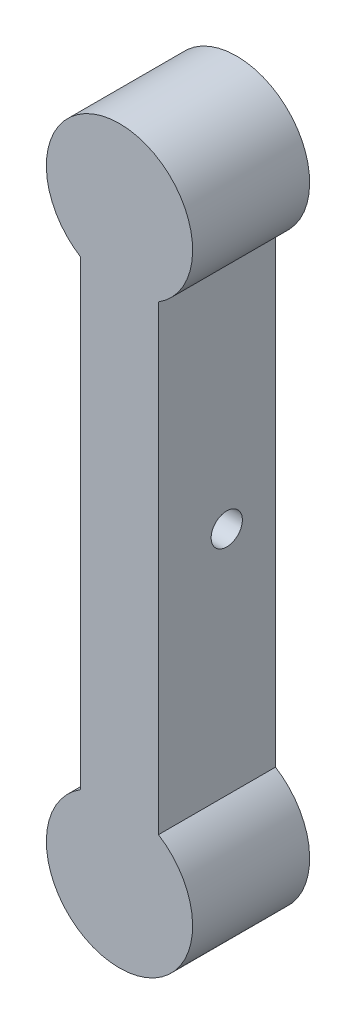
ISO-10303-21;
HEADER;
FILE_DESCRIPTION(('STEP AP214'),'2;1');
FILE_NAME('part.step','',(''),(''),'','','');
FILE_SCHEMA(('AUTOMOTIVE_DESIGN { 1 0 10303 214 1 1 1 1 }'));
ENDSEC;
DATA;
#1=APPLICATION_CONTEXT('core data for automotive mechanical design processes');
#2=APPLICATION_PROTOCOL_DEFINITION('international standard','automotive_design',2000,#1);
#3=PRODUCT_CONTEXT('',#1,'mechanical');
#4=PRODUCT('Part','Part','',(#3));
#5=PRODUCT_RELATED_PRODUCT_CATEGORY('part','',(#4));
#6=PRODUCT_DEFINITION_FORMATION('','',#4);
#7=PRODUCT_DEFINITION_CONTEXT('part definition',#1,'design');
#8=PRODUCT_DEFINITION('design','',#6,#7);
#9=PRODUCT_DEFINITION_SHAPE('','',#8);
#10=(LENGTH_UNIT() NAMED_UNIT(*) SI_UNIT(.MILLI.,.METRE.));
#11=(NAMED_UNIT(*) PLANE_ANGLE_UNIT() SI_UNIT($,.RADIAN.));
#12=(NAMED_UNIT(*) SI_UNIT($,.STERADIAN.) SOLID_ANGLE_UNIT());
#13=UNCERTAINTY_MEASURE_WITH_UNIT(LENGTH_MEASURE(1.E-05),#10,'distance_accuracy_value','');
#14=(GEOMETRIC_REPRESENTATION_CONTEXT(3) GLOBAL_UNCERTAINTY_ASSIGNED_CONTEXT((#13)) GLOBAL_UNIT_ASSIGNED_CONTEXT((#10,
#11,#12)) REPRESENTATION_CONTEXT('',''));
#15=CARTESIAN_POINT('',(0.,0.,0.));
#16=DIRECTION('',(0.,0.,1.));
#17=DIRECTION('',(1.,0.,0.));
#18=AXIS2_PLACEMENT_3D('',#15,#16,#17);
#19=CARTESIAN_POINT('',(0.,60.,0.));
#20=DIRECTION('',(0.,0.,1.));
#21=DIRECTION('',(1.,0.,0.));
#22=AXIS2_PLACEMENT_3D('',#19,#20,#21);
#23=PLANE('',#22);
#24=CARTESIAN_POINT('',(0.,60.,0.));
#25=DIRECTION('',(0.,0.,1.));
#26=DIRECTION('',(1.,0.,0.));
#27=AXIS2_PLACEMENT_3D('',#24,#25,#26);
#28=CIRCLE('',#27,7.5);
#29=CARTESIAN_POINT('',(3.99999999999999,53.6557112297752,0.));
#30=VERTEX_POINT('',#29);
#31=CARTESIAN_POINT('',(-3.99999999999999,53.6557112297752,0.));
#32=VERTEX_POINT('',#31);
#33=EDGE_CURVE('E80',#30,#32,#28,.T.);
#34=ORIENTED_EDGE('',*,*,#33,.F.);
#35=DIRECTION('',(0.,1.,0.));
#36=VECTOR('',#35,1.);
#37=CARTESIAN_POINT('',(3.99999999999999,53.6557112297752,0.));
#38=LINE('',#37,#36);
#39=CARTESIAN_POINT('',(4.00000000000001,6.34428877022476,0.));
#40=VERTEX_POINT('',#39);
#41=EDGE_CURVE('E49',#40,#30,#38,.T.);
#42=ORIENTED_EDGE('',*,*,#41,.F.);
#43=CARTESIAN_POINT('',(0.,0.,0.));
#44=DIRECTION('',(0.,0.,1.));
#45=DIRECTION('',(1.,0.,0.));
#46=AXIS2_PLACEMENT_3D('',#43,#44,#45);
#47=CIRCLE('',#46,7.50000000000001);
#48=CARTESIAN_POINT('',(-4.,6.34428877022476,0.));
#49=VERTEX_POINT('',#48);
#50=EDGE_CURVE('E57',#49,#40,#47,.T.);
#51=ORIENTED_EDGE('',*,*,#50,.F.);
#52=DIRECTION('',(0.,-1.,0.));
#53=VECTOR('',#52,1.);
#54=CARTESIAN_POINT('',(-3.99999999999999,53.6557112297752,0.));
#55=LINE('',#54,#53);
#56=EDGE_CURVE('E114',#32,#49,#55,.T.);
#57=ORIENTED_EDGE('',*,*,#56,.F.);
#58=EDGE_LOOP('',(#34,#42,#51,#57));
#59=FACE_BOUND('',#58,.T.);
#60=CARTESIAN_POINT('',(0.,60.,0.));
#61=DIRECTION('',(0.,0.,1.));
#62=DIRECTION('',(1.,0.,0.));
#63=AXIS2_PLACEMENT_3D('',#60,#61,#62);
#64=CIRCLE('',#63,4.00000000000001);
#65=CARTESIAN_POINT('',(4.00000000000001,60.,0.));
#66=VERTEX_POINT('',#65);
#67=EDGE_CURVE('E110',#66,#66,#64,.T.);
#68=ORIENTED_EDGE('',*,*,#67,.T.);
#69=EDGE_LOOP('',(#68));
#70=FACE_BOUND('',#69,.T.);
#71=CARTESIAN_POINT('',(0.,0.,0.));
#72=DIRECTION('',(0.,0.,1.));
#73=DIRECTION('',(1.,0.,0.));
#74=AXIS2_PLACEMENT_3D('',#71,#72,#73);
#75=CIRCLE('',#74,4.);
#76=CARTESIAN_POINT('',(4.,0.,0.));
#77=VERTEX_POINT('',#76);
#78=EDGE_CURVE('E107',#77,#77,#75,.T.);
#79=ORIENTED_EDGE('',*,*,#78,.T.);
#80=EDGE_LOOP('',(#79));
#81=FACE_BOUND('',#80,.T.);
#82=ADVANCED_FACE('F33',(#59,#70,#81),#23,.F.);
#83=CARTESIAN_POINT('',(0.,60.,10.));
#84=DIRECTION('',(0.,0.,-1.));
#85=DIRECTION('',(-1.,0.,0.));
#86=AXIS2_PLACEMENT_3D('',#83,#84,#85);
#87=CYLINDRICAL_SURFACE('',#86,7.5);
#88=ORIENTED_EDGE('',*,*,#33,.T.);
#89=DIRECTION('',(0.,0.,-1.));
#90=VECTOR('',#89,1.);
#91=CARTESIAN_POINT('',(-3.99999999999999,53.6557112297752,10.));
#92=LINE('',#91,#90);
#93=CARTESIAN_POINT('',(-3.99999999999999,53.6557112297752,12.));
#94=VERTEX_POINT('',#93);
#95=EDGE_CURVE('E11',#94,#32,#92,.T.);
#96=ORIENTED_EDGE('',*,*,#95,.F.);
#97=CARTESIAN_POINT('',(0.,60.,12.));
#98=DIRECTION('',(0.,0.,1.));
#99=DIRECTION('',(1.,0.,0.));
#100=AXIS2_PLACEMENT_3D('',#97,#98,#99);
#101=CIRCLE('',#100,7.5);
#102=CARTESIAN_POINT('',(4.00000000000001,53.6557112297752,12.));
#103=VERTEX_POINT('',#102);
#104=EDGE_CURVE('E78',#103,#94,#101,.T.);
#105=ORIENTED_EDGE('',*,*,#104,.F.);
#106=DIRECTION('',(0.,0.,-1.));
#107=VECTOR('',#106,1.);
#108=CARTESIAN_POINT('',(3.99999999999999,53.6557112297752,10.));
#109=LINE('',#108,#107);
#110=EDGE_CURVE('E118',#103,#30,#109,.T.);
#111=ORIENTED_EDGE('',*,*,#110,.T.);
#112=EDGE_LOOP('',(#88,#96,#105,#111));
#113=FACE_BOUND('',#112,.T.);
#114=ADVANCED_FACE('F35',(#113),#87,.T.);
#115=CARTESIAN_POINT('',(-3.99999999999999,53.6557112297752,10.));
#116=DIRECTION('',(1.,0.,0.));
#117=DIRECTION('',(0.,1.,0.));
#118=AXIS2_PLACEMENT_3D('',#115,#116,#117);
#119=PLANE('',#118);
#120=CARTESIAN_POINT('',(-4.,30.,5.));
#121=DIRECTION('',(-1.,0.,0.));
#122=DIRECTION('',(0.,-1.,0.));
#123=AXIS2_PLACEMENT_3D('',#120,#121,#122);
#124=CIRCLE('',#123,1.6);
#125=CARTESIAN_POINT('',(-4.,28.4,5.));
#126=VERTEX_POINT('',#125);
#127=EDGE_CURVE('E104',#126,#126,#124,.T.);
#128=ORIENTED_EDGE('',*,*,#127,.F.);
#129=EDGE_LOOP('',(#128));
#130=FACE_BOUND('',#129,.T.);
#131=ORIENTED_EDGE('',*,*,#56,.T.);
#132=DIRECTION('',(0.,0.,-1.));
#133=VECTOR('',#132,1.);
#134=CARTESIAN_POINT('',(-4.,6.34428877022476,10.));
#135=LINE('',#134,#133);
#136=CARTESIAN_POINT('',(-3.99999999999999,6.34428877022476,12.));
#137=VERTEX_POINT('',#136);
#138=EDGE_CURVE('E42',#137,#49,#135,.T.);
#139=ORIENTED_EDGE('',*,*,#138,.F.);
#140=DIRECTION('',(0.,-1.,0.));
#141=VECTOR('',#140,1.);
#142=CARTESIAN_POINT('',(-3.99999999999999,53.6557112297752,12.));
#143=LINE('',#142,#141);
#144=EDGE_CURVE('E83',#94,#137,#143,.T.);
#145=ORIENTED_EDGE('',*,*,#144,.F.);
#146=ORIENTED_EDGE('',*,*,#95,.T.);
#147=EDGE_LOOP('',(#131,#139,#145,#146));
#148=FACE_BOUND('',#147,.T.);
#149=ADVANCED_FACE('F84',(#130,#148),#119,.F.);
#150=CARTESIAN_POINT('',(0.,0.,10.));
#151=DIRECTION('',(0.,0.,-1.));
#152=DIRECTION('',(-1.,0.,0.));
#153=AXIS2_PLACEMENT_3D('',#150,#151,#152);
#154=CYLINDRICAL_SURFACE('',#153,7.50000000000001);
#155=ORIENTED_EDGE('',*,*,#50,.T.);
#156=DIRECTION('',(0.,0.,-1.));
#157=VECTOR('',#156,1.);
#158=CARTESIAN_POINT('',(4.00000000000001,6.34428877022476,10.));
#159=LINE('',#158,#157);
#160=CARTESIAN_POINT('',(4.00000000000001,6.34428877022475,12.));
#161=VERTEX_POINT('',#160);
#162=EDGE_CURVE('E120',#161,#40,#159,.T.);
#163=ORIENTED_EDGE('',*,*,#162,.F.);
#164=CARTESIAN_POINT('',(0.,0.,12.));
#165=DIRECTION('',(0.,0.,1.));
#166=DIRECTION('',(1.,0.,0.));
#167=AXIS2_PLACEMENT_3D('',#164,#165,#166);
#168=CIRCLE('',#167,7.5);
#169=EDGE_CURVE('E88',#137,#161,#168,.T.);
#170=ORIENTED_EDGE('',*,*,#169,.F.);
#171=ORIENTED_EDGE('',*,*,#138,.T.);
#172=EDGE_LOOP('',(#155,#163,#170,#171));
#173=FACE_BOUND('',#172,.T.);
#174=ADVANCED_FACE('F122',(#173),#154,.T.);
#175=CARTESIAN_POINT('',(3.99999999999999,53.6557112297752,10.));
#176=DIRECTION('',(-1.,0.,0.));
#177=DIRECTION('',(0.,-1.,0.));
#178=AXIS2_PLACEMENT_3D('',#175,#176,#177);
#179=PLANE('',#178);
#180=CARTESIAN_POINT('',(4.,30.,5.));
#181=DIRECTION('',(-1.,0.,0.));
#182=DIRECTION('',(0.,-1.,0.));
#183=AXIS2_PLACEMENT_3D('',#180,#181,#182);
#184=CIRCLE('',#183,1.6);
#185=CARTESIAN_POINT('',(4.00000000000001,28.4,5.));
#186=VERTEX_POINT('',#185);
#187=EDGE_CURVE('E37',#186,#186,#184,.T.);
#188=ORIENTED_EDGE('',*,*,#187,.T.);
#189=EDGE_LOOP('',(#188));
#190=FACE_BOUND('',#189,.T.);
#191=ORIENTED_EDGE('',*,*,#41,.T.);
#192=ORIENTED_EDGE('',*,*,#110,.F.);
#193=DIRECTION('',(0.,1.,0.));
#194=VECTOR('',#193,1.);
#195=CARTESIAN_POINT('',(4.00000000000001,53.6557112297752,12.));
#196=LINE('',#195,#194);
#197=EDGE_CURVE('E93',#161,#103,#196,.T.);
#198=ORIENTED_EDGE('',*,*,#197,.F.);
#199=ORIENTED_EDGE('',*,*,#162,.T.);
#200=EDGE_LOOP('',(#191,#192,#198,#199));
#201=FACE_BOUND('',#200,.T.);
#202=ADVANCED_FACE('F144',(#190,#201),#179,.F.);
#203=CARTESIAN_POINT('',(0.,60.,10.));
#204=DIRECTION('',(0.,0.,-1.));
#205=DIRECTION('',(-1.,0.,0.));
#206=AXIS2_PLACEMENT_3D('',#203,#204,#205);
#207=CYLINDRICAL_SURFACE('',#206,4.00000000000001);
#208=CARTESIAN_POINT('',(0.,60.,10.));
#209=DIRECTION('',(0.,0.,1.));
#210=DIRECTION('',(1.,0.,0.));
#211=AXIS2_PLACEMENT_3D('',#208,#209,#210);
#212=CIRCLE('',#211,4.00000000000001);
#213=CARTESIAN_POINT('',(4.00000000000001,60.,10.));
#214=VERTEX_POINT('',#213);
#215=EDGE_CURVE('E101',#214,#214,#212,.T.);
#216=ORIENTED_EDGE('',*,*,#215,.T.);
#217=EDGE_LOOP('',(#216));
#218=FACE_BOUND('',#217,.T.);
#219=ORIENTED_EDGE('',*,*,#67,.F.);
#220=EDGE_LOOP('',(#219));
#221=FACE_BOUND('',#220,.T.);
#222=ADVANCED_FACE('F134',(#218,#221),#207,.F.);
#223=CARTESIAN_POINT('',(0.,0.,10.));
#224=DIRECTION('',(0.,0.,-1.));
#225=DIRECTION('',(-1.,0.,0.));
#226=AXIS2_PLACEMENT_3D('',#223,#224,#225);
#227=CYLINDRICAL_SURFACE('',#226,4.);
#228=CARTESIAN_POINT('',(0.,0.,10.));
#229=DIRECTION('',(0.,0.,1.));
#230=DIRECTION('',(1.,0.,0.));
#231=AXIS2_PLACEMENT_3D('',#228,#229,#230);
#232=CIRCLE('',#231,4.);
#233=CARTESIAN_POINT('',(4.,0.,10.));
#234=VERTEX_POINT('',#233);
#235=EDGE_CURVE('E98',#234,#234,#232,.T.);
#236=ORIENTED_EDGE('',*,*,#235,.T.);
#237=EDGE_LOOP('',(#236));
#238=FACE_BOUND('',#237,.T.);
#239=ORIENTED_EDGE('',*,*,#78,.F.);
#240=EDGE_LOOP('',(#239));
#241=FACE_BOUND('',#240,.T.);
#242=ADVANCED_FACE('F131',(#238,#241),#227,.F.);
#243=CARTESIAN_POINT('',(6.,30.,5.));
#244=DIRECTION('',(-1.,0.,0.));
#245=DIRECTION('',(0.,-1.,0.));
#246=AXIS2_PLACEMENT_3D('',#243,#244,#245);
#247=CYLINDRICAL_SURFACE('',#246,1.6);
#248=ORIENTED_EDGE('',*,*,#127,.T.);
#249=EDGE_LOOP('',(#248));
#250=FACE_BOUND('',#249,.T.);
#251=ORIENTED_EDGE('',*,*,#187,.F.);
#252=EDGE_LOOP('',(#251));
#253=FACE_BOUND('',#252,.T.);
#254=ADVANCED_FACE('F133',(#250,#253),#247,.F.);
#255=CARTESIAN_POINT('',(0.,60.,10.));
#256=DIRECTION('',(0.,0.,1.));
#257=DIRECTION('',(1.,0.,0.));
#258=AXIS2_PLACEMENT_3D('',#255,#256,#257);
#259=PLANE('',#258);
#260=ORIENTED_EDGE('',*,*,#235,.F.);
#261=EDGE_LOOP('',(#260));
#262=FACE_BOUND('',#261,.T.);
#263=ADVANCED_FACE('F141',(#262),#259,.F.);
#264=ORIENTED_EDGE('',*,*,#215,.F.);
#265=EDGE_LOOP('',(#264));
#266=FACE_BOUND('',#265,.T.);
#267=ADVANCED_FACE('F220',(#266),#259,.F.);
#268=CARTESIAN_POINT('',(0.,60.,12.));
#269=DIRECTION('',(0.,0.,1.));
#270=DIRECTION('',(1.,0.,0.));
#271=AXIS2_PLACEMENT_3D('',#268,#269,#270);
#272=PLANE('',#271);
#273=ORIENTED_EDGE('',*,*,#104,.T.);
#274=ORIENTED_EDGE('',*,*,#144,.T.);
#275=ORIENTED_EDGE('',*,*,#169,.T.);
#276=ORIENTED_EDGE('',*,*,#197,.T.);
#277=EDGE_LOOP('',(#273,#274,#275,#276));
#278=FACE_BOUND('',#277,.T.);
#279=ADVANCED_FACE('F91',(#278),#272,.T.);
#280=CLOSED_SHELL('',(#82,#114,#149,#174,#202,#222,#242,#254,#263,#267,#279));
#281=MANIFOLD_SOLID_BREP('B2',#280);
#282=ADVANCED_BREP_SHAPE_REPRESENTATION('',(#18,#281),#14);
#283=SHAPE_DEFINITION_REPRESENTATION(#9,#282);
ENDSEC;
END-ISO-10303-21;
